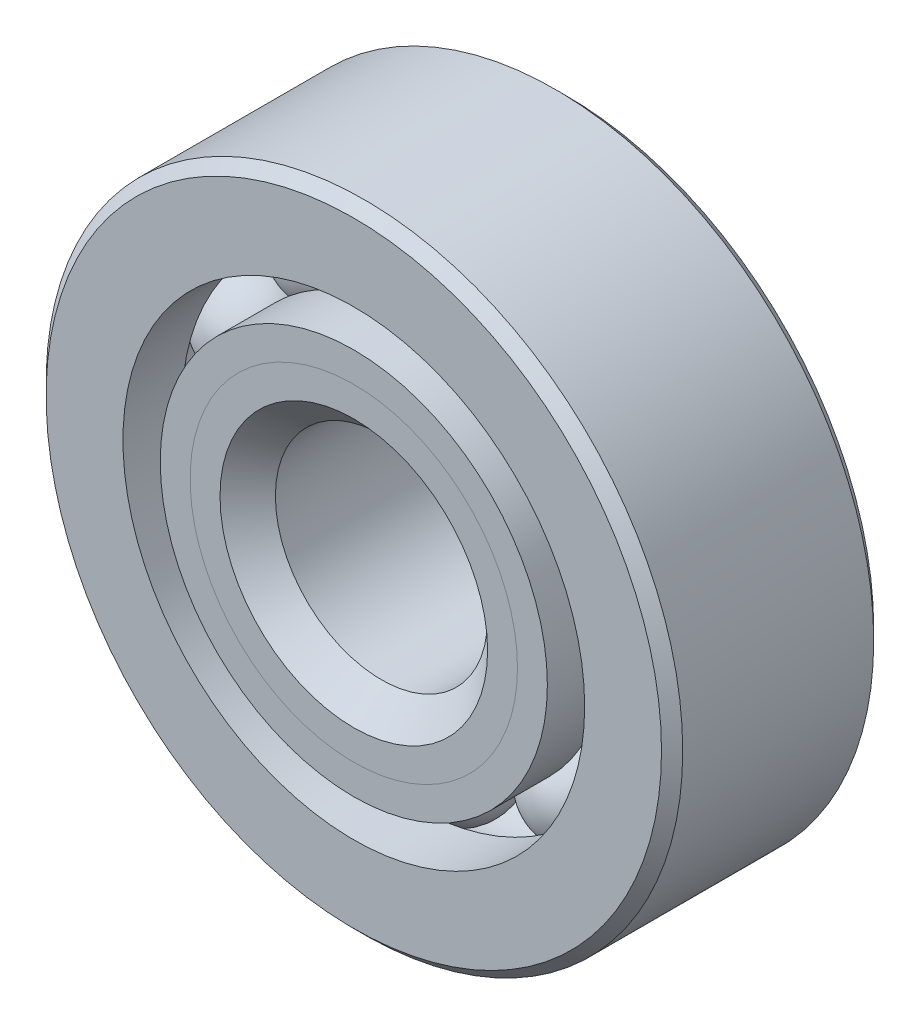
ISO-10303-21;
HEADER;
FILE_DESCRIPTION(('STEP AP214'),'2;1');
FILE_NAME('part.step','',(''),(''),'','','');
FILE_SCHEMA(('AUTOMOTIVE_DESIGN { 1 0 10303 214 1 1 1 1 }'));
ENDSEC;
DATA;
#1=APPLICATION_CONTEXT('core data for automotive mechanical design processes');
#2=APPLICATION_PROTOCOL_DEFINITION('international standard','automotive_design',2000,#1);
#3=PRODUCT_CONTEXT('',#1,'mechanical');
#4=PRODUCT('Part','Part','',(#3));
#5=PRODUCT_RELATED_PRODUCT_CATEGORY('part','',(#4));
#6=PRODUCT_DEFINITION_FORMATION('','',#4);
#7=PRODUCT_DEFINITION_CONTEXT('part definition',#1,'design');
#8=PRODUCT_DEFINITION('design','',#6,#7);
#9=PRODUCT_DEFINITION_SHAPE('','',#8);
#10=(LENGTH_UNIT() NAMED_UNIT(*) SI_UNIT(.MILLI.,.METRE.));
#11=(NAMED_UNIT(*) PLANE_ANGLE_UNIT() SI_UNIT($,.RADIAN.));
#12=(NAMED_UNIT(*) SI_UNIT($,.STERADIAN.) SOLID_ANGLE_UNIT());
#13=UNCERTAINTY_MEASURE_WITH_UNIT(LENGTH_MEASURE(1.E-05),#10,'distance_accuracy_value','');
#14=(GEOMETRIC_REPRESENTATION_CONTEXT(3) GLOBAL_UNCERTAINTY_ASSIGNED_CONTEXT((#13)) GLOBAL_UNIT_ASSIGNED_CONTEXT((#10,
#11,#12)) REPRESENTATION_CONTEXT('',''));
#15=CARTESIAN_POINT('',(0.,0.,0.));
#16=DIRECTION('',(0.,0.,1.));
#17=DIRECTION('',(1.,0.,0.));
#18=AXIS2_PLACEMENT_3D('',#15,#16,#17);
#19=CARTESIAN_POINT('',(-5.5986545280857,7.70588687142145,0.));
#20=DIRECTION('',(0.,0.,1.));
#21=DIRECTION('',(-0.587785252292462,0.809016994374955,0.));
#22=AXIS2_PLACEMENT_3D('',#19,#20,#21);
#23=SPHERICAL_SURFACE('',#22,2.27628073054021);
#24=CARTESIAN_POINT('',(-5.5986545280857,7.70588687142145,2.27628073054021));
#25=VERTEX_POINT('',#24);
#26=VERTEX_LOOP('',#25);
#27=FACE_BOUND('',#26,.T.);
#28=ADVANCED_FACE('F37',(#27),#23,.T.);
#29=CLOSED_SHELL('',(#28));
#30=MANIFOLD_SOLID_BREP('B2',#29);
#31=CARTESIAN_POINT('',(-9.05881331771131,2.94338687142148,0.));
#32=DIRECTION('',(0.,0.,1.));
#33=DIRECTION('',(-0.95105651629515,0.309016994374958,0.));
#34=AXIS2_PLACEMENT_3D('',#31,#32,#33);
#35=SPHERICAL_SURFACE('',#34,2.27628073054021);
#36=CARTESIAN_POINT('',(-9.05881331771131,2.94338687142148,2.27628073054021));
#37=VERTEX_POINT('',#36);
#38=VERTEX_LOOP('',#37);
#39=FACE_BOUND('',#38,.T.);
#40=ADVANCED_FACE('F68',(#39),#35,.T.);
#41=CLOSED_SHELL('',(#40));
#42=MANIFOLD_SOLID_BREP('B6',#41);
#43=CARTESIAN_POINT('',(-9.05881331771137,-2.94338687142129,0.));
#44=DIRECTION('',(0.,0.,1.));
#45=DIRECTION('',(-0.951056516295157,-0.309016994374938,0.));
#46=AXIS2_PLACEMENT_3D('',#43,#44,#45);
#47=SPHERICAL_SURFACE('',#46,2.27628073054021);
#48=CARTESIAN_POINT('',(-9.05881331771137,-2.94338687142129,2.27628073054021));
#49=VERTEX_POINT('',#48);
#50=VERTEX_LOOP('',#49);
#51=FACE_BOUND('',#50,.T.);
#52=ADVANCED_FACE('F99',(#51),#47,.T.);
#53=CLOSED_SHELL('',(#52));
#54=MANIFOLD_SOLID_BREP('B33',#53);
#55=CARTESIAN_POINT('',(-5.59865452808587,-7.70588687142132,0.));
#56=DIRECTION('',(0.,0.,1.));
#57=DIRECTION('',(-0.58778525229248,-0.809016994374942,0.));
#58=AXIS2_PLACEMENT_3D('',#55,#56,#57);
#59=SPHERICAL_SURFACE('',#58,2.27628073054021);
#60=CARTESIAN_POINT('',(-5.59865452808587,-7.70588687142132,2.27628073054021));
#61=VERTEX_POINT('',#60);
#62=VERTEX_LOOP('',#61);
#63=FACE_BOUND('',#62,.T.);
#64=ADVANCED_FACE('F130',(#63),#59,.T.);
#65=CLOSED_SHELL('',(#64));
#66=MANIFOLD_SOLID_BREP('B64',#65);
#67=CARTESIAN_POINT('',(0.,-9.525,0.));
#68=DIRECTION('',(0.,0.,1.));
#69=DIRECTION('',(0.,-1.,0.));
#70=AXIS2_PLACEMENT_3D('',#67,#68,#69);
#71=SPHERICAL_SURFACE('',#70,2.27628073054021);
#72=CARTESIAN_POINT('',(0.,-9.525,2.27628073054021));
#73=VERTEX_POINT('',#72);
#74=VERTEX_LOOP('',#73);
#75=FACE_BOUND('',#74,.T.);
#76=ADVANCED_FACE('F161',(#75),#71,.T.);
#77=CLOSED_SHELL('',(#76));
#78=MANIFOLD_SOLID_BREP('B95',#77);
#79=CARTESIAN_POINT('',(5.59865452808576,-7.70588687142141,0.));
#80=DIRECTION('',(0.,0.,1.));
#81=DIRECTION('',(0.587785252292469,-0.809016994374951,0.));
#82=AXIS2_PLACEMENT_3D('',#79,#80,#81);
#83=SPHERICAL_SURFACE('',#82,2.27628073054021);
#84=CARTESIAN_POINT('',(5.59865452808576,-7.70588687142141,2.27628073054021));
#85=VERTEX_POINT('',#84);
#86=VERTEX_LOOP('',#85);
#87=FACE_BOUND('',#86,.T.);
#88=ADVANCED_FACE('F192',(#87),#83,.T.);
#89=CLOSED_SHELL('',(#88));
#90=MANIFOLD_SOLID_BREP('B126',#89);
#91=CARTESIAN_POINT('',(9.05881331771133,-2.94338687142141,0.));
#92=DIRECTION('',(0.,0.,1.));
#93=DIRECTION('',(0.951056516295152,-0.309016994374952,0.));
#94=AXIS2_PLACEMENT_3D('',#91,#92,#93);
#95=SPHERICAL_SURFACE('',#94,2.27628073054021);
#96=CARTESIAN_POINT('',(9.05881331771133,-2.94338687142141,2.27628073054021));
#97=VERTEX_POINT('',#96);
#98=VERTEX_LOOP('',#97);
#99=FACE_BOUND('',#98,.T.);
#100=ADVANCED_FACE('F221',(#99),#95,.T.);
#101=CLOSED_SHELL('',(#100));
#102=MANIFOLD_SOLID_BREP('B157',#101);
#103=CARTESIAN_POINT('',(9.05881331771135,2.94338687142135,0.));
#104=DIRECTION('',(0.,0.,1.));
#105=DIRECTION('',(0.951056516295155,0.309016994374945,0.));
#106=AXIS2_PLACEMENT_3D('',#103,#104,#105);
#107=SPHERICAL_SURFACE('',#106,2.27628073054021);
#108=CARTESIAN_POINT('',(9.05881331771135,2.94338687142135,2.27628073054021));
#109=VERTEX_POINT('',#108);
#110=VERTEX_LOOP('',#109);
#111=FACE_BOUND('',#110,.T.);
#112=ADVANCED_FACE('F252',(#111),#107,.T.);
#113=CLOSED_SHELL('',(#112));
#114=MANIFOLD_SOLID_BREP('B188',#113);
#115=CARTESIAN_POINT('',(5.59865452808582,7.70588687142137,0.));
#116=DIRECTION('',(0.,0.,1.));
#117=DIRECTION('',(0.587785252292474,0.809016994374947,0.));
#118=AXIS2_PLACEMENT_3D('',#115,#116,#117);
#119=SPHERICAL_SURFACE('',#118,2.27628073054021);
#120=CARTESIAN_POINT('',(5.59865452808582,7.70588687142137,2.27628073054021));
#121=VERTEX_POINT('',#120);
#122=VERTEX_LOOP('',#121);
#123=FACE_BOUND('',#122,.T.);
#124=ADVANCED_FACE('F283',(#123),#119,.T.);
#125=CLOSED_SHELL('',(#124));
#126=MANIFOLD_SOLID_BREP('B217',#125);
#127=CARTESIAN_POINT('',(0.,9.525,0.));
#128=DIRECTION('',(0.,0.,1.));
#129=DIRECTION('',(0.,1.,0.));
#130=AXIS2_PLACEMENT_3D('',#127,#128,#129);
#131=SPHERICAL_SURFACE('',#130,2.27628073054021);
#132=CARTESIAN_POINT('',(0.,9.525,2.27628073054021));
#133=VERTEX_POINT('',#132);
#134=VERTEX_LOOP('',#133);
#135=FACE_BOUND('',#134,.T.);
#136=ADVANCED_FACE('F316',(#135),#131,.T.);
#137=CLOSED_SHELL('',(#136));
#138=MANIFOLD_SOLID_BREP('B248',#137);
#139=CARTESIAN_POINT('',(0.,7.34662349868363,4.7625));
#140=DIRECTION('',(0.,0.,-1.));
#141=DIRECTION('',(-1.,0.,0.));
#142=AXIS2_PLACEMENT_3D('',#139,#140,#141);
#143=PLANE('',#142);
#144=CARTESIAN_POINT('',(0.,0.,4.7625));
#145=DIRECTION('',(0.,0.,1.));
#146=DIRECTION('',(1.,0.,0.));
#147=AXIS2_PLACEMENT_3D('',#144,#145,#146);
#148=CIRCLE('',#147,6.00560963472989);
#149=CARTESIAN_POINT('',(6.00560963472989,0.,4.7625));
#150=VERTEX_POINT('',#149);
#151=EDGE_CURVE('E370',#150,#150,#148,.T.);
#152=ORIENTED_EDGE('',*,*,#151,.F.);
#153=EDGE_LOOP('',(#152));
#154=FACE_BOUND('',#153,.T.);
#155=CARTESIAN_POINT('',(0.,0.,4.7625));
#156=DIRECTION('',(0.,0.,1.));
#157=DIRECTION('',(1.,0.,0.));
#158=AXIS2_PLACEMENT_3D('',#155,#156,#157);
#159=CIRCLE('',#158,7.34662349868363);
#160=CARTESIAN_POINT('',(7.34662349868363,0.,4.7625));
#161=VERTEX_POINT('',#160);
#162=EDGE_CURVE('E315',#161,#161,#159,.T.);
#163=ORIENTED_EDGE('',*,*,#162,.T.);
#164=EDGE_LOOP('',(#163));
#165=FACE_BOUND('',#164,.T.);
#166=ADVANCED_FACE('F336',(#154,#165),#143,.F.);
#167=CARTESIAN_POINT('',(0.,0.,3.42148613604627));
#168=DIRECTION('',(0.,0.,1.));
#169=DIRECTION('',(1.,0.,0.));
#170=AXIS2_PLACEMENT_3D('',#167,#168,#169);
#171=CONICAL_SURFACE('',#170,6.00560963472989,0.78539816339745);
#172=ORIENTED_EDGE('',*,*,#162,.F.);
#173=EDGE_LOOP('',(#172));
#174=FACE_BOUND('',#173,.T.);
#175=CARTESIAN_POINT('',(0.,0.,3.42148613604627));
#176=DIRECTION('',(0.,0.,1.));
#177=DIRECTION('',(1.,0.,0.));
#178=AXIS2_PLACEMENT_3D('',#175,#176,#177);
#179=CIRCLE('',#178,6.00560963472989);
#180=CARTESIAN_POINT('',(6.00560963472989,0.,3.42148613604627));
#181=VERTEX_POINT('',#180);
#182=EDGE_CURVE('E342',#181,#181,#179,.T.);
#183=ORIENTED_EDGE('',*,*,#182,.T.);
#184=EDGE_LOOP('',(#183));
#185=FACE_BOUND('',#184,.T.);
#186=ADVANCED_FACE('F377',(#174,#185),#171,.T.);
#187=CARTESIAN_POINT('',(0.,0.,4.7625));
#188=DIRECTION('',(0.,0.,1.));
#189=DIRECTION('',(1.,0.,0.));
#190=AXIS2_PLACEMENT_3D('',#187,#188,#189);
#191=CYLINDRICAL_SURFACE('',#190,6.00560963472989);
#192=ORIENTED_EDGE('',*,*,#182,.F.);
#193=EDGE_LOOP('',(#192));
#194=FACE_BOUND('',#193,.T.);
#195=CARTESIAN_POINT('',(0.,0.,0.));
#196=DIRECTION('',(0.,0.,1.));
#197=DIRECTION('',(1.,0.,0.));
#198=AXIS2_PLACEMENT_3D('',#195,#196,#197);
#199=CIRCLE('',#198,6.00560963472989);
#200=CARTESIAN_POINT('',(6.00560963472989,0.,0.));
#201=VERTEX_POINT('',#200);
#202=EDGE_CURVE('E346',#201,#201,#199,.T.);
#203=ORIENTED_EDGE('',*,*,#202,.T.);
#204=EDGE_LOOP('',(#203));
#205=FACE_BOUND('',#204,.T.);
#206=ADVANCED_FACE('F381',(#194,#205),#191,.T.);
#207=CARTESIAN_POINT('',(0.,6.00560963472989,0.));
#208=DIRECTION('',(0.,0.,-1.));
#209=DIRECTION('',(-1.,0.,0.));
#210=AXIS2_PLACEMENT_3D('',#207,#208,#209);
#211=PLANE('',#210);
#212=ORIENTED_EDGE('',*,*,#202,.F.);
#213=EDGE_LOOP('',(#212));
#214=FACE_BOUND('',#213,.T.);
#215=CARTESIAN_POINT('',(0.,0.,0.));
#216=DIRECTION('',(0.,0.,1.));
#217=DIRECTION('',(1.,0.,0.));
#218=AXIS2_PLACEMENT_3D('',#215,#216,#217);
#219=CIRCLE('',#218,7.24871926945979);
#220=CARTESIAN_POINT('',(7.24871926945979,0.,0.));
#221=VERTEX_POINT('',#220);
#222=EDGE_CURVE('E350',#221,#221,#219,.T.);
#223=ORIENTED_EDGE('',*,*,#222,.T.);
#224=EDGE_LOOP('',(#223));
#225=FACE_BOUND('',#224,.T.);
#226=ADVANCED_FACE('F386',(#214,#225),#211,.F.);
#227=CARTESIAN_POINT('',(0.,0.,0.));
#228=DIRECTION('',(0.,0.,1.));
#229=DIRECTION('',(1.,0.,0.));
#230=AXIS2_PLACEMENT_3D('',#227,#228,#229);
#231=TOROIDAL_SURFACE('',#230,9.525,2.27628073054021);
#232=ORIENTED_EDGE('',*,*,#222,.F.);
#233=EDGE_LOOP('',(#232));
#234=FACE_BOUND('',#233,.T.);
#235=CARTESIAN_POINT('',(0.,0.,-2.11666666666667));
#236=DIRECTION('',(0.,0.,1.));
#237=DIRECTION('',(1.,0.,0.));
#238=AXIS2_PLACEMENT_3D('',#235,#236,#237);
#239=CIRCLE('',#238,8.68763736263737);
#240=CARTESIAN_POINT('',(8.68763736263737,0.,-2.11666666666667));
#241=VERTEX_POINT('',#240);
#242=EDGE_CURVE('E355',#241,#241,#239,.T.);
#243=ORIENTED_EDGE('',*,*,#242,.T.);
#244=EDGE_LOOP('',(#243));
#245=FACE_BOUND('',#244,.T.);
#246=ADVANCED_FACE('F392',(#234,#245),#231,.F.);
#247=CARTESIAN_POINT('',(0.,0.,4.7625));
#248=DIRECTION('',(0.,0.,1.));
#249=DIRECTION('',(1.,0.,0.));
#250=AXIS2_PLACEMENT_3D('',#247,#248,#249);
#251=CYLINDRICAL_SURFACE('',#250,8.68763736263737);
#252=ORIENTED_EDGE('',*,*,#242,.F.);
#253=EDGE_LOOP('',(#252));
#254=FACE_BOUND('',#253,.T.);
#255=CARTESIAN_POINT('',(0.,0.,-4.76250000000001));
#256=DIRECTION('',(0.,0.,1.));
#257=DIRECTION('',(1.,0.,0.));
#258=AXIS2_PLACEMENT_3D('',#255,#256,#257);
#259=CIRCLE('',#258,8.68763736263737);
#260=CARTESIAN_POINT('',(8.68763736263737,0.,-4.76250000000001));
#261=VERTEX_POINT('',#260);
#262=EDGE_CURVE('E358',#261,#261,#259,.T.);
#263=ORIENTED_EDGE('',*,*,#262,.T.);
#264=EDGE_LOOP('',(#263));
#265=FACE_BOUND('',#264,.T.);
#266=ADVANCED_FACE('F396',(#254,#265),#251,.T.);
#267=CARTESIAN_POINT('',(0.,5.23875,-4.7625));
#268=DIRECTION('',(0.,0.,1.));
#269=DIRECTION('',(1.,0.,0.));
#270=AXIS2_PLACEMENT_3D('',#267,#268,#269);
#271=PLANE('',#270);
#272=ORIENTED_EDGE('',*,*,#262,.F.);
#273=EDGE_LOOP('',(#272));
#274=FACE_BOUND('',#273,.T.);
#275=CARTESIAN_POINT('',(0.,0.,-4.7625));
#276=DIRECTION('',(0.,0.,1.));
#277=DIRECTION('',(1.,0.,0.));
#278=AXIS2_PLACEMENT_3D('',#275,#276,#277);
#279=CIRCLE('',#278,5.23875);
#280=CARTESIAN_POINT('',(5.23875,0.,-4.7625));
#281=VERTEX_POINT('',#280);
#282=EDGE_CURVE('E361',#281,#281,#279,.T.);
#283=ORIENTED_EDGE('',*,*,#282,.T.);
#284=EDGE_LOOP('',(#283));
#285=FACE_BOUND('',#284,.T.);
#286=ADVANCED_FACE('F400',(#274,#285),#271,.F.);
#287=CARTESIAN_POINT('',(0.,0.,-4.28625));
#288=DIRECTION('',(0.,0.,-1.));
#289=DIRECTION('',(-1.,0.,0.));
#290=AXIS2_PLACEMENT_3D('',#287,#288,#289);
#291=CONICAL_SURFACE('',#290,4.7625,0.785398163397447);
#292=ORIENTED_EDGE('',*,*,#282,.F.);
#293=EDGE_LOOP('',(#292));
#294=FACE_BOUND('',#293,.T.);
#295=CARTESIAN_POINT('',(0.,0.,-4.28625));
#296=DIRECTION('',(0.,0.,1.));
#297=DIRECTION('',(1.,0.,0.));
#298=AXIS2_PLACEMENT_3D('',#295,#296,#297);
#299=CIRCLE('',#298,4.7625);
#300=CARTESIAN_POINT('',(4.7625,0.,-4.28625));
#301=VERTEX_POINT('',#300);
#302=EDGE_CURVE('E364',#301,#301,#299,.T.);
#303=ORIENTED_EDGE('',*,*,#302,.T.);
#304=EDGE_LOOP('',(#303));
#305=FACE_BOUND('',#304,.T.);
#306=ADVANCED_FACE('F404',(#294,#305),#291,.F.);
#307=CARTESIAN_POINT('',(0.,0.,4.7625));
#308=DIRECTION('',(0.,0.,1.));
#309=DIRECTION('',(1.,0.,0.));
#310=AXIS2_PLACEMENT_3D('',#307,#308,#309);
#311=CYLINDRICAL_SURFACE('',#310,4.7625);
#312=ORIENTED_EDGE('',*,*,#302,.F.);
#313=EDGE_LOOP('',(#312));
#314=FACE_BOUND('',#313,.T.);
#315=CARTESIAN_POINT('',(0.,0.,3.51939036527011));
#316=DIRECTION('',(0.,0.,1.));
#317=DIRECTION('',(1.,0.,0.));
#318=AXIS2_PLACEMENT_3D('',#315,#316,#317);
#319=CIRCLE('',#318,4.7625);
#320=CARTESIAN_POINT('',(4.7625,0.,3.51939036527011));
#321=VERTEX_POINT('',#320);
#322=EDGE_CURVE('E367',#321,#321,#319,.T.);
#323=ORIENTED_EDGE('',*,*,#322,.T.);
#324=EDGE_LOOP('',(#323));
#325=FACE_BOUND('',#324,.T.);
#326=ADVANCED_FACE('F408',(#314,#325),#311,.F.);
#327=CARTESIAN_POINT('',(0.,0.,4.7625));
#328=DIRECTION('',(0.,0.,1.));
#329=DIRECTION('',(1.,0.,0.));
#330=AXIS2_PLACEMENT_3D('',#327,#328,#329);
#331=CONICAL_SURFACE('',#330,6.00560963472989,0.785398163397451);
#332=ORIENTED_EDGE('',*,*,#322,.F.);
#333=EDGE_LOOP('',(#332));
#334=FACE_BOUND('',#333,.T.);
#335=ORIENTED_EDGE('',*,*,#151,.T.);
#336=EDGE_LOOP('',(#335));
#337=FACE_BOUND('',#336,.T.);
#338=ADVANCED_FACE('F374',(#334,#337),#331,.F.);
#339=CLOSED_SHELL('',(#166,#186,#206,#226,#246,#266,#286,#306,#326,#338));
#340=MANIFOLD_SOLID_BREP('B279',#339);
#341=CARTESIAN_POINT('',(0.,8.68763736263737,4.7625));
#342=DIRECTION('',(0.,0.,-1.));
#343=DIRECTION('',(-1.,0.,0.));
#344=AXIS2_PLACEMENT_3D('',#341,#342,#343);
#345=PLANE('',#344);
#346=CARTESIAN_POINT('',(0.,0.,4.7625));
#347=DIRECTION('',(0.,0.,1.));
#348=DIRECTION('',(1.,0.,0.));
#349=AXIS2_PLACEMENT_3D('',#346,#347,#348);
#350=CIRCLE('',#349,7.34662349868363);
#351=CARTESIAN_POINT('',(7.34662349868363,0.,4.7625));
#352=VERTEX_POINT('',#351);
#353=EDGE_CURVE('E335',#352,#352,#350,.T.);
#354=ORIENTED_EDGE('',*,*,#353,.F.);
#355=EDGE_LOOP('',(#354));
#356=FACE_BOUND('',#355,.T.);
#357=CARTESIAN_POINT('',(0.,0.,4.7625));
#358=DIRECTION('',(0.,0.,1.));
#359=DIRECTION('',(1.,0.,0.));
#360=AXIS2_PLACEMENT_3D('',#357,#358,#359);
#361=CIRCLE('',#360,8.68763736263737);
#362=CARTESIAN_POINT('',(8.68763736263737,0.,4.7625));
#363=VERTEX_POINT('',#362);
#364=EDGE_CURVE('E516',#363,#363,#361,.T.);
#365=ORIENTED_EDGE('',*,*,#364,.T.);
#366=EDGE_LOOP('',(#365));
#367=FACE_BOUND('',#366,.T.);
#368=ADVANCED_FACE('F494',(#356,#367),#345,.F.);
#369=CARTESIAN_POINT('',(0.,0.,4.7625));
#370=DIRECTION('',(0.,0.,1.));
#371=DIRECTION('',(1.,0.,0.));
#372=AXIS2_PLACEMENT_3D('',#369,#370,#371);
#373=CONICAL_SURFACE('',#372,7.34662349868363,0.78539816339745);
#374=CARTESIAN_POINT('',(0.,0.,3.42148613604627));
#375=DIRECTION('',(0.,0.,1.));
#376=DIRECTION('',(1.,0.,0.));
#377=AXIS2_PLACEMENT_3D('',#374,#375,#376);
#378=CIRCLE('',#377,6.00560963472989);
#379=CARTESIAN_POINT('',(6.00560963472989,0.,3.42148613604627));
#380=VERTEX_POINT('',#379);
#381=EDGE_CURVE('E500',#380,#380,#378,.T.);
#382=ORIENTED_EDGE('',*,*,#381,.F.);
#383=EDGE_LOOP('',(#382));
#384=FACE_BOUND('',#383,.T.);
#385=ORIENTED_EDGE('',*,*,#353,.T.);
#386=EDGE_LOOP('',(#385));
#387=FACE_BOUND('',#386,.T.);
#388=ADVANCED_FACE('F541',(#384,#387),#373,.F.);
#389=CARTESIAN_POINT('',(0.,0.,4.7625));
#390=DIRECTION('',(0.,0.,1.));
#391=DIRECTION('',(1.,0.,0.));
#392=AXIS2_PLACEMENT_3D('',#389,#390,#391);
#393=CYLINDRICAL_SURFACE('',#392,6.00560963472989);
#394=CARTESIAN_POINT('',(0.,0.,0.));
#395=DIRECTION('',(0.,0.,1.));
#396=DIRECTION('',(1.,0.,0.));
#397=AXIS2_PLACEMENT_3D('',#394,#395,#396);
#398=CIRCLE('',#397,6.00560963472989);
#399=CARTESIAN_POINT('',(6.00560963472989,0.,0.));
#400=VERTEX_POINT('',#399);
#401=EDGE_CURVE('E504',#400,#400,#398,.T.);
#402=ORIENTED_EDGE('',*,*,#401,.F.);
#403=EDGE_LOOP('',(#402));
#404=FACE_BOUND('',#403,.T.);
#405=ORIENTED_EDGE('',*,*,#381,.T.);
#406=EDGE_LOOP('',(#405));
#407=FACE_BOUND('',#406,.T.);
#408=ADVANCED_FACE('F536',(#404,#407),#393,.F.);
#409=CARTESIAN_POINT('',(0.,6.00560963472989,0.));
#410=DIRECTION('',(0.,0.,1.));
#411=DIRECTION('',(1.,0.,0.));
#412=AXIS2_PLACEMENT_3D('',#409,#410,#411);
#413=PLANE('',#412);
#414=CARTESIAN_POINT('',(0.,0.,0.));
#415=DIRECTION('',(0.,0.,1.));
#416=DIRECTION('',(1.,0.,0.));
#417=AXIS2_PLACEMENT_3D('',#414,#415,#416);
#418=CIRCLE('',#417,7.24871926945979);
#419=CARTESIAN_POINT('',(7.24871926945979,0.,0.));
#420=VERTEX_POINT('',#419);
#421=EDGE_CURVE('E508',#420,#420,#418,.T.);
#422=ORIENTED_EDGE('',*,*,#421,.F.);
#423=EDGE_LOOP('',(#422));
#424=FACE_BOUND('',#423,.T.);
#425=ORIENTED_EDGE('',*,*,#401,.T.);
#426=EDGE_LOOP('',(#425));
#427=FACE_BOUND('',#426,.T.);
#428=ADVANCED_FACE('F530',(#424,#427),#413,.F.);
#429=CARTESIAN_POINT('',(0.,0.,0.));
#430=DIRECTION('',(0.,0.,1.));
#431=DIRECTION('',(1.,0.,0.));
#432=AXIS2_PLACEMENT_3D('',#429,#430,#431);
#433=TOROIDAL_SURFACE('',#432,9.525,2.27628073054021);
#434=CARTESIAN_POINT('',(0.,0.,2.11666666666666));
#435=DIRECTION('',(0.,0.,1.));
#436=DIRECTION('',(1.,0.,0.));
#437=AXIS2_PLACEMENT_3D('',#434,#435,#436);
#438=CIRCLE('',#437,8.68763736263737);
#439=CARTESIAN_POINT('',(8.68763736263737,0.,2.11666666666666));
#440=VERTEX_POINT('',#439);
#441=EDGE_CURVE('E513',#440,#440,#438,.T.);
#442=ORIENTED_EDGE('',*,*,#441,.F.);
#443=EDGE_LOOP('',(#442));
#444=FACE_BOUND('',#443,.T.);
#445=ORIENTED_EDGE('',*,*,#421,.T.);
#446=EDGE_LOOP('',(#445));
#447=FACE_BOUND('',#446,.T.);
#448=ADVANCED_FACE('F524',(#444,#447),#433,.F.);
#449=CARTESIAN_POINT('',(0.,0.,4.7625));
#450=DIRECTION('',(0.,0.,1.));
#451=DIRECTION('',(1.,0.,0.));
#452=AXIS2_PLACEMENT_3D('',#449,#450,#451);
#453=CYLINDRICAL_SURFACE('',#452,8.68763736263737);
#454=ORIENTED_EDGE('',*,*,#364,.F.);
#455=EDGE_LOOP('',(#454));
#456=FACE_BOUND('',#455,.T.);
#457=ORIENTED_EDGE('',*,*,#441,.T.);
#458=EDGE_LOOP('',(#457));
#459=FACE_BOUND('',#458,.T.);
#460=ADVANCED_FACE('F521',(#456,#459),#453,.T.);
#461=CLOSED_SHELL('',(#368,#388,#408,#428,#448,#460));
#462=MANIFOLD_SOLID_BREP('B310',#461);
#463=CARTESIAN_POINT('',(0.,0.,4.28625));
#464=DIRECTION('',(0.,0.,-1.));
#465=DIRECTION('',(-1.,0.,0.));
#466=AXIS2_PLACEMENT_3D('',#463,#464,#465);
#467=CONICAL_SURFACE('',#466,14.2875,0.785398163397446);
#468=CARTESIAN_POINT('',(0.,0.,4.7625));
#469=DIRECTION('',(0.,0.,1.));
#470=DIRECTION('',(1.,0.,0.));
#471=AXIS2_PLACEMENT_3D('',#468,#469,#470);
#472=CIRCLE('',#471,13.81125);
#473=CARTESIAN_POINT('',(13.81125,0.,4.7625));
#474=VERTEX_POINT('',#473);
#475=EDGE_CURVE('E613',#474,#474,#472,.T.);
#476=ORIENTED_EDGE('',*,*,#475,.F.);
#477=EDGE_LOOP('',(#476));
#478=FACE_BOUND('',#477,.T.);
#479=CARTESIAN_POINT('',(0.,0.,4.28625));
#480=DIRECTION('',(0.,0.,1.));
#481=DIRECTION('',(1.,0.,0.));
#482=AXIS2_PLACEMENT_3D('',#479,#480,#481);
#483=CIRCLE('',#482,14.2875);
#484=CARTESIAN_POINT('',(14.2875,0.,4.28625));
#485=VERTEX_POINT('',#484);
#486=EDGE_CURVE('E493',#485,#485,#483,.T.);
#487=ORIENTED_EDGE('',*,*,#486,.T.);
#488=EDGE_LOOP('',(#487));
#489=FACE_BOUND('',#488,.T.);
#490=ADVANCED_FACE('F585',(#478,#489),#467,.T.);
#491=CARTESIAN_POINT('',(0.,0.,4.7625));
#492=DIRECTION('',(0.,0.,1.));
#493=DIRECTION('',(1.,0.,0.));
#494=AXIS2_PLACEMENT_3D('',#491,#492,#493);
#495=CYLINDRICAL_SURFACE('',#494,14.2875);
#496=ORIENTED_EDGE('',*,*,#486,.F.);
#497=EDGE_LOOP('',(#496));
#498=FACE_BOUND('',#497,.T.);
#499=CARTESIAN_POINT('',(0.,0.,-4.28625));
#500=DIRECTION('',(0.,0.,1.));
#501=DIRECTION('',(1.,0.,0.));
#502=AXIS2_PLACEMENT_3D('',#499,#500,#501);
#503=CIRCLE('',#502,14.2875);
#504=CARTESIAN_POINT('',(14.2875,0.,-4.28625));
#505=VERTEX_POINT('',#504);
#506=EDGE_CURVE('E591',#505,#505,#503,.T.);
#507=ORIENTED_EDGE('',*,*,#506,.T.);
#508=EDGE_LOOP('',(#507));
#509=FACE_BOUND('',#508,.T.);
#510=ADVANCED_FACE('F620',(#498,#509),#495,.T.);
#511=CARTESIAN_POINT('',(0.,0.,-4.76250000000001));
#512=DIRECTION('',(0.,0.,1.));
#513=DIRECTION('',(1.,0.,0.));
#514=AXIS2_PLACEMENT_3D('',#511,#512,#513);
#515=CONICAL_SURFACE('',#514,13.81125,0.785398163397439);
#516=ORIENTED_EDGE('',*,*,#506,.F.);
#517=EDGE_LOOP('',(#516));
#518=FACE_BOUND('',#517,.T.);
#519=CARTESIAN_POINT('',(0.,0.,-4.76250000000001));
#520=DIRECTION('',(0.,0.,1.));
#521=DIRECTION('',(1.,0.,0.));
#522=AXIS2_PLACEMENT_3D('',#519,#520,#521);
#523=CIRCLE('',#522,13.81125);
#524=CARTESIAN_POINT('',(13.81125,0.,-4.76250000000001));
#525=VERTEX_POINT('',#524);
#526=EDGE_CURVE('E595',#525,#525,#523,.T.);
#527=ORIENTED_EDGE('',*,*,#526,.T.);
#528=EDGE_LOOP('',(#527));
#529=FACE_BOUND('',#528,.T.);
#530=ADVANCED_FACE('F624',(#518,#529),#515,.T.);
#531=CARTESIAN_POINT('',(0.,13.81125,-4.76250000000001));
#532=DIRECTION('',(0.,0.,1.));
#533=DIRECTION('',(1.,0.,0.));
#534=AXIS2_PLACEMENT_3D('',#531,#532,#533);
#535=PLANE('',#534);
#536=ORIENTED_EDGE('',*,*,#526,.F.);
#537=EDGE_LOOP('',(#536));
#538=FACE_BOUND('',#537,.T.);
#539=CARTESIAN_POINT('',(0.,0.,-4.76250000000001));
#540=DIRECTION('',(0.,0.,1.));
#541=DIRECTION('',(1.,0.,0.));
#542=AXIS2_PLACEMENT_3D('',#539,#540,#541);
#543=CIRCLE('',#542,10.3623626373626);
#544=CARTESIAN_POINT('',(10.3623626373626,0.,-4.76250000000001));
#545=VERTEX_POINT('',#544);
#546=EDGE_CURVE('E599',#545,#545,#543,.T.);
#547=ORIENTED_EDGE('',*,*,#546,.T.);
#548=EDGE_LOOP('',(#547));
#549=FACE_BOUND('',#548,.T.);
#550=ADVANCED_FACE('F629',(#538,#549),#535,.F.);
#551=CARTESIAN_POINT('',(0.,0.,4.7625));
#552=DIRECTION('',(0.,0.,1.));
#553=DIRECTION('',(1.,0.,0.));
#554=AXIS2_PLACEMENT_3D('',#551,#552,#553);
#555=CYLINDRICAL_SURFACE('',#554,10.3623626373626);
#556=ORIENTED_EDGE('',*,*,#546,.F.);
#557=EDGE_LOOP('',(#556));
#558=FACE_BOUND('',#557,.T.);
#559=CARTESIAN_POINT('',(0.,0.,-2.11666666666667));
#560=DIRECTION('',(0.,0.,1.));
#561=DIRECTION('',(1.,0.,0.));
#562=AXIS2_PLACEMENT_3D('',#559,#560,#561);
#563=CIRCLE('',#562,10.3623626373626);
#564=CARTESIAN_POINT('',(10.3623626373626,0.,-2.11666666666667));
#565=VERTEX_POINT('',#564);
#566=EDGE_CURVE('E604',#565,#565,#563,.T.);
#567=ORIENTED_EDGE('',*,*,#566,.T.);
#568=EDGE_LOOP('',(#567));
#569=FACE_BOUND('',#568,.T.);
#570=ADVANCED_FACE('F635',(#558,#569),#555,.F.);
#571=CARTESIAN_POINT('',(0.,0.,0.));
#572=DIRECTION('',(0.,0.,1.));
#573=DIRECTION('',(1.,0.,0.));
#574=AXIS2_PLACEMENT_3D('',#571,#572,#573);
#575=TOROIDAL_SURFACE('',#574,9.525,2.27628073054021);
#576=ORIENTED_EDGE('',*,*,#566,.F.);
#577=EDGE_LOOP('',(#576));
#578=FACE_BOUND('',#577,.T.);
#579=CARTESIAN_POINT('',(0.,0.,2.11666666666666));
#580=DIRECTION('',(0.,0.,1.));
#581=DIRECTION('',(1.,0.,0.));
#582=AXIS2_PLACEMENT_3D('',#579,#580,#581);
#583=CIRCLE('',#582,10.3623626373626);
#584=CARTESIAN_POINT('',(10.3623626373626,0.,2.11666666666666));
#585=VERTEX_POINT('',#584);
#586=EDGE_CURVE('E607',#585,#585,#583,.T.);
#587=ORIENTED_EDGE('',*,*,#586,.T.);
#588=EDGE_LOOP('',(#587));
#589=FACE_BOUND('',#588,.T.);
#590=ADVANCED_FACE('F639',(#578,#589),#575,.F.);
#591=CARTESIAN_POINT('',(0.,0.,4.7625));
#592=DIRECTION('',(0.,0.,1.));
#593=DIRECTION('',(1.,0.,0.));
#594=AXIS2_PLACEMENT_3D('',#591,#592,#593);
#595=CYLINDRICAL_SURFACE('',#594,10.3623626373626);
#596=ORIENTED_EDGE('',*,*,#586,.F.);
#597=EDGE_LOOP('',(#596));
#598=FACE_BOUND('',#597,.T.);
#599=CARTESIAN_POINT('',(0.,0.,4.7625));
#600=DIRECTION('',(0.,0.,1.));
#601=DIRECTION('',(1.,0.,0.));
#602=AXIS2_PLACEMENT_3D('',#599,#600,#601);
#603=CIRCLE('',#602,10.3623626373626);
#604=CARTESIAN_POINT('',(10.3623626373626,0.,4.7625));
#605=VERTEX_POINT('',#604);
#606=EDGE_CURVE('E610',#605,#605,#603,.T.);
#607=ORIENTED_EDGE('',*,*,#606,.T.);
#608=EDGE_LOOP('',(#607));
#609=FACE_BOUND('',#608,.T.);
#610=ADVANCED_FACE('F643',(#598,#609),#595,.F.);
#611=CARTESIAN_POINT('',(0.,13.81125,4.7625));
#612=DIRECTION('',(0.,0.,-1.));
#613=DIRECTION('',(-1.,0.,0.));
#614=AXIS2_PLACEMENT_3D('',#611,#612,#613);
#615=PLANE('',#614);
#616=ORIENTED_EDGE('',*,*,#606,.F.);
#617=EDGE_LOOP('',(#616));
#618=FACE_BOUND('',#617,.T.);
#619=ORIENTED_EDGE('',*,*,#475,.T.);
#620=EDGE_LOOP('',(#619));
#621=FACE_BOUND('',#620,.T.);
#622=ADVANCED_FACE('F617',(#618,#621),#615,.F.);
#623=CLOSED_SHELL('',(#490,#510,#530,#550,#570,#590,#610,#622));
#624=MANIFOLD_SOLID_BREP('B330',#623);
#625=ADVANCED_BREP_SHAPE_REPRESENTATION('',(#18,#30,#42,#54,#66,#78,#90,#102,#114,#126,#138,
#340,#462,#624),#14);
#626=SHAPE_DEFINITION_REPRESENTATION(#9,#625);
ENDSEC;
END-ISO-10303-21;
